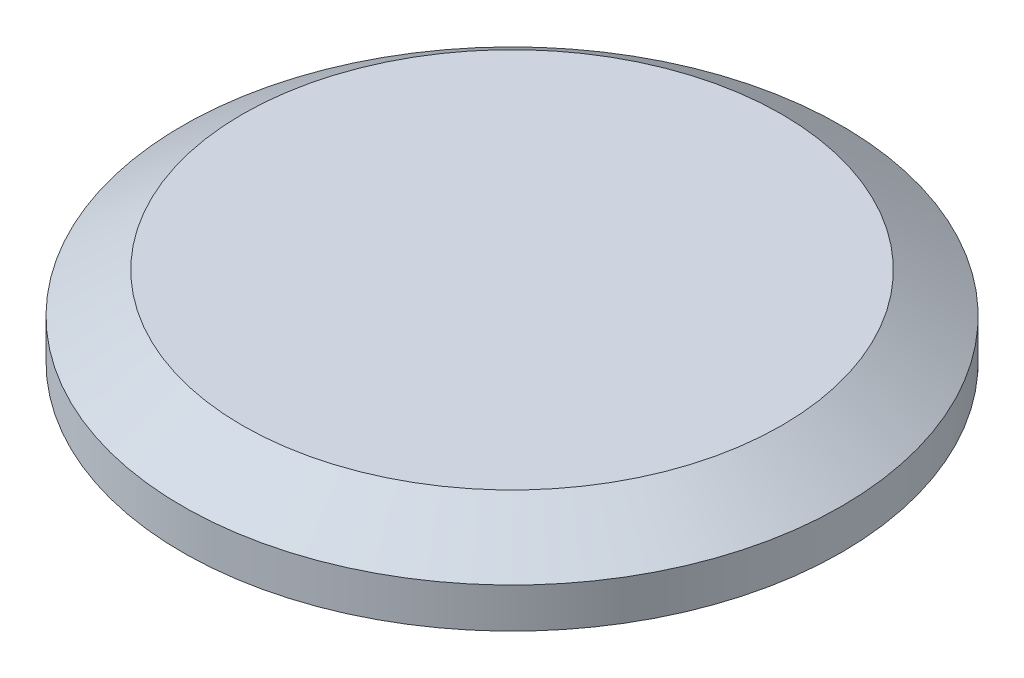
ISO-10303-21;
HEADER;
FILE_DESCRIPTION(('STEP AP214'),'2;1');
FILE_NAME('part.step','',(''),(''),'','','');
FILE_SCHEMA(('AUTOMOTIVE_DESIGN { 1 0 10303 214 1 1 1 1 }'));
ENDSEC;
DATA;
#1=APPLICATION_CONTEXT('core data for automotive mechanical design processes');
#2=APPLICATION_PROTOCOL_DEFINITION('international standard','automotive_design',2000,#1);
#3=PRODUCT_CONTEXT('',#1,'mechanical');
#4=PRODUCT('Part','Part','',(#3));
#5=PRODUCT_RELATED_PRODUCT_CATEGORY('part','',(#4));
#6=PRODUCT_DEFINITION_FORMATION('','',#4);
#7=PRODUCT_DEFINITION_CONTEXT('part definition',#1,'design');
#8=PRODUCT_DEFINITION('design','',#6,#7);
#9=PRODUCT_DEFINITION_SHAPE('','',#8);
#10=(LENGTH_UNIT() NAMED_UNIT(*) SI_UNIT(.MILLI.,.METRE.));
#11=(NAMED_UNIT(*) PLANE_ANGLE_UNIT() SI_UNIT($,.RADIAN.));
#12=(NAMED_UNIT(*) SI_UNIT($,.STERADIAN.) SOLID_ANGLE_UNIT());
#13=UNCERTAINTY_MEASURE_WITH_UNIT(LENGTH_MEASURE(1.E-05),#10,'distance_accuracy_value','');
#14=(GEOMETRIC_REPRESENTATION_CONTEXT(3) GLOBAL_UNCERTAINTY_ASSIGNED_CONTEXT((#13)) GLOBAL_UNIT_ASSIGNED_CONTEXT((#10,
#11,#12)) REPRESENTATION_CONTEXT('',''));
#15=CARTESIAN_POINT('',(0.,0.,0.));
#16=DIRECTION('',(0.,0.,1.));
#17=DIRECTION('',(1.,0.,0.));
#18=AXIS2_PLACEMENT_3D('',#15,#16,#17);
#19=CARTESIAN_POINT('',(0.,0.,0.));
#20=DIRECTION('',(0.,1.,0.));
#21=DIRECTION('',(-1.,0.,0.));
#22=AXIS2_PLACEMENT_3D('',#19,#20,#21);
#23=PLANE('',#22);
#24=CARTESIAN_POINT('',(0.,0.,0.));
#25=DIRECTION('',(0.,-1.,0.));
#26=DIRECTION('',(1.,0.,0.));
#27=AXIS2_PLACEMENT_3D('',#24,#25,#26);
#28=CIRCLE('',#27,3.);
#29=CARTESIAN_POINT('',(3.,0.,0.));
#30=VERTEX_POINT('',#29);
#31=EDGE_CURVE('E10',#30,#30,#28,.T.);
#32=ORIENTED_EDGE('',*,*,#31,.T.);
#33=EDGE_LOOP('',(#32));
#34=FACE_BOUND('',#33,.T.);
#35=ADVANCED_FACE('F33',(#34),#23,.F.);
#36=CARTESIAN_POINT('',(0.,0.,0.));
#37=DIRECTION('',(0.,-1.,0.));
#38=DIRECTION('',(1.,0.,0.));
#39=AXIS2_PLACEMENT_3D('',#36,#37,#38);
#40=CYLINDRICAL_SURFACE('',#39,3.);
#41=ORIENTED_EDGE('',*,*,#31,.F.);
#42=EDGE_LOOP('',(#41));
#43=FACE_BOUND('',#42,.T.);
#44=CARTESIAN_POINT('',(0.,9.,0.));
#45=DIRECTION('',(0.,-1.,0.));
#46=DIRECTION('',(1.,0.,0.));
#47=AXIS2_PLACEMENT_3D('',#44,#45,#46);
#48=CIRCLE('',#47,3.);
#49=CARTESIAN_POINT('',(3.,9.,0.));
#50=VERTEX_POINT('',#49);
#51=EDGE_CURVE('E39',#50,#50,#48,.T.);
#52=ORIENTED_EDGE('',*,*,#51,.T.);
#53=EDGE_LOOP('',(#52));
#54=FACE_BOUND('',#53,.T.);
#55=ADVANCED_FACE('F71',(#43,#54),#40,.T.);
#56=CARTESIAN_POINT('',(-3.,9.,0.));
#57=DIRECTION('',(0.,1.,0.));
#58=DIRECTION('',(-1.,0.,0.));
#59=AXIS2_PLACEMENT_3D('',#56,#57,#58);
#60=PLANE('',#59);
#61=ORIENTED_EDGE('',*,*,#51,.F.);
#62=EDGE_LOOP('',(#61));
#63=FACE_BOUND('',#62,.T.);
#64=CARTESIAN_POINT('',(0.,9.,0.));
#65=DIRECTION('',(0.,-1.,0.));
#66=DIRECTION('',(1.,0.,0.));
#67=AXIS2_PLACEMENT_3D('',#64,#65,#66);
#68=CIRCLE('',#67,13.5);
#69=CARTESIAN_POINT('',(13.5,8.99999999999999,0.));
#70=VERTEX_POINT('',#69);
#71=EDGE_CURVE('E43',#70,#70,#68,.T.);
#72=ORIENTED_EDGE('',*,*,#71,.T.);
#73=EDGE_LOOP('',(#72));
#74=FACE_BOUND('',#73,.T.);
#75=ADVANCED_FACE('F75',(#63,#74),#60,.F.);
#76=CARTESIAN_POINT('',(0.,6.99999999999999,0.));
#77=DIRECTION('',(0.,-1.,0.));
#78=DIRECTION('',(1.,0.,0.));
#79=AXIS2_PLACEMENT_3D('',#76,#77,#78);
#80=CONICAL_SURFACE('',#79,16.5,0.98279372324733);
#81=ORIENTED_EDGE('',*,*,#71,.F.);
#82=EDGE_LOOP('',(#81));
#83=FACE_BOUND('',#82,.T.);
#84=CARTESIAN_POINT('',(0.,6.99999999999999,0.));
#85=DIRECTION('',(0.,-1.,0.));
#86=DIRECTION('',(1.,0.,0.));
#87=AXIS2_PLACEMENT_3D('',#84,#85,#86);
#88=CIRCLE('',#87,16.5);
#89=CARTESIAN_POINT('',(16.5,6.99999999999999,0.));
#90=VERTEX_POINT('',#89);
#91=EDGE_CURVE('E47',#90,#90,#88,.T.);
#92=ORIENTED_EDGE('',*,*,#91,.T.);
#93=EDGE_LOOP('',(#92));
#94=FACE_BOUND('',#93,.T.);
#95=ADVANCED_FACE('F80',(#83,#94),#80,.F.);
#96=CARTESIAN_POINT('',(0.,0.,0.));
#97=DIRECTION('',(0.,-1.,0.));
#98=DIRECTION('',(1.,0.,0.));
#99=AXIS2_PLACEMENT_3D('',#96,#97,#98);
#100=CYLINDRICAL_SURFACE('',#99,16.5);
#101=ORIENTED_EDGE('',*,*,#91,.F.);
#102=EDGE_LOOP('',(#101));
#103=FACE_BOUND('',#102,.T.);
#104=CARTESIAN_POINT('',(0.,8.99999999999999,0.));
#105=DIRECTION('',(0.,-1.,0.));
#106=DIRECTION('',(1.,0.,0.));
#107=AXIS2_PLACEMENT_3D('',#104,#105,#106);
#108=CIRCLE('',#107,16.5);
#109=CARTESIAN_POINT('',(16.5,8.99999999999999,0.));
#110=VERTEX_POINT('',#109);
#111=EDGE_CURVE('E52',#110,#110,#108,.T.);
#112=ORIENTED_EDGE('',*,*,#111,.T.);
#113=EDGE_LOOP('',(#112));
#114=FACE_BOUND('',#113,.T.);
#115=ADVANCED_FACE('F67',(#103,#114),#100,.T.);
#116=CARTESIAN_POINT('',(0.,11.,0.));
#117=DIRECTION('',(0.,-1.,0.));
#118=DIRECTION('',(1.,0.,0.));
#119=AXIS2_PLACEMENT_3D('',#116,#117,#118);
#120=CONICAL_SURFACE('',#119,13.5,0.98279372324733);
#121=ORIENTED_EDGE('',*,*,#111,.F.);
#122=EDGE_LOOP('',(#121));
#123=FACE_BOUND('',#122,.T.);
#124=CARTESIAN_POINT('',(0.,11.,0.));
#125=DIRECTION('',(0.,-1.,0.));
#126=DIRECTION('',(1.,0.,0.));
#127=AXIS2_PLACEMENT_3D('',#124,#125,#126);
#128=CIRCLE('',#127,13.5);
#129=CARTESIAN_POINT('',(13.5,11.,0.));
#130=VERTEX_POINT('',#129);
#131=EDGE_CURVE('E55',#130,#130,#128,.T.);
#132=ORIENTED_EDGE('',*,*,#131,.T.);
#133=EDGE_LOOP('',(#132));
#134=FACE_BOUND('',#133,.T.);
#135=ADVANCED_FACE('F59',(#123,#134),#120,.T.);
#136=CARTESIAN_POINT('',(-13.5,11.,0.));
#137=DIRECTION('',(0.,-1.,0.));
#138=DIRECTION('',(1.,0.,0.));
#139=AXIS2_PLACEMENT_3D('',#136,#137,#138);
#140=PLANE('',#139);
#141=ORIENTED_EDGE('',*,*,#131,.F.);
#142=EDGE_LOOP('',(#141));
#143=FACE_BOUND('',#142,.T.);
#144=ADVANCED_FACE('F61',(#143),#140,.F.);
#145=CLOSED_SHELL('',(#35,#55,#75,#95,#115,#135,#144));
#146=MANIFOLD_SOLID_BREP('B2',#145);
#147=ADVANCED_BREP_SHAPE_REPRESENTATION('',(#18,#146),#14);
#148=SHAPE_DEFINITION_REPRESENTATION(#9,#147);
ENDSEC;
END-ISO-10303-21;
